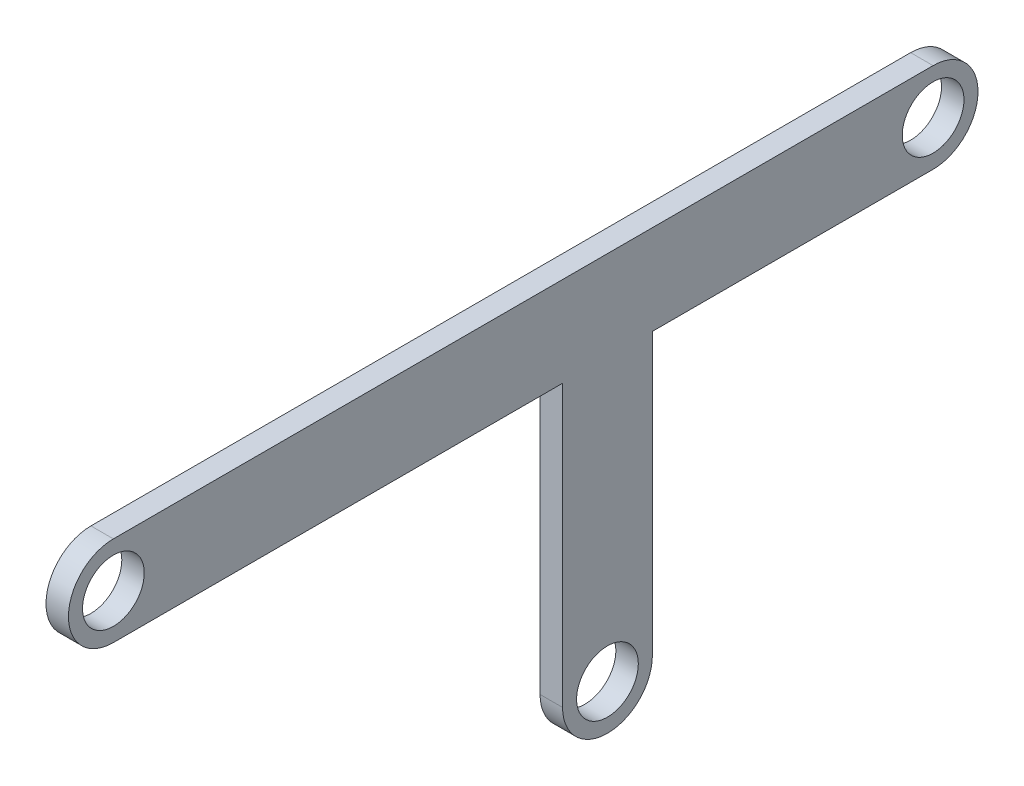
ISO-10303-21;
HEADER;
FILE_DESCRIPTION(('STEP AP214'),'2;1');
FILE_NAME('part.step','',(''),(''),'','','');
FILE_SCHEMA(('AUTOMOTIVE_DESIGN { 1 0 10303 214 1 1 1 1 }'));
ENDSEC;
DATA;
#1=APPLICATION_CONTEXT('core data for automotive mechanical design processes');
#2=APPLICATION_PROTOCOL_DEFINITION('international standard','automotive_design',2000,#1);
#3=PRODUCT_CONTEXT('',#1,'mechanical');
#4=PRODUCT('Part','Part','',(#3));
#5=PRODUCT_RELATED_PRODUCT_CATEGORY('part','',(#4));
#6=PRODUCT_DEFINITION_FORMATION('','',#4);
#7=PRODUCT_DEFINITION_CONTEXT('part definition',#1,'design');
#8=PRODUCT_DEFINITION('design','',#6,#7);
#9=PRODUCT_DEFINITION_SHAPE('','',#8);
#10=(LENGTH_UNIT() NAMED_UNIT(*) SI_UNIT(.MILLI.,.METRE.));
#11=(NAMED_UNIT(*) PLANE_ANGLE_UNIT() SI_UNIT($,.RADIAN.));
#12=(NAMED_UNIT(*) SI_UNIT($,.STERADIAN.) SOLID_ANGLE_UNIT());
#13=UNCERTAINTY_MEASURE_WITH_UNIT(LENGTH_MEASURE(1.E-05),#10,'distance_accuracy_value','');
#14=(GEOMETRIC_REPRESENTATION_CONTEXT(3) GLOBAL_UNCERTAINTY_ASSIGNED_CONTEXT((#13)) GLOBAL_UNIT_ASSIGNED_CONTEXT((#10,
#11,#12)) REPRESENTATION_CONTEXT('',''));
#15=CARTESIAN_POINT('',(0.,0.,0.));
#16=DIRECTION('',(0.,0.,1.));
#17=DIRECTION('',(1.,0.,0.));
#18=AXIS2_PLACEMENT_3D('',#15,#16,#17);
#19=CARTESIAN_POINT('',(-2.,0.,-44.));
#20=DIRECTION('',(0.,0.,1.));
#21=DIRECTION('',(1.,0.,0.));
#22=AXIS2_PLACEMENT_3D('',#19,#20,#21);
#23=PLANE('',#22);
#24=DIRECTION('',(0.,-1.,0.));
#25=VECTOR('',#24,1.);
#26=CARTESIAN_POINT('',(0.,0.,-44.));
#27=LINE('',#26,#25);
#28=CARTESIAN_POINT('',(0.,4.00000000000001,-44.));
#29=VERTEX_POINT('',#28);
#30=CARTESIAN_POINT('',(0.,-21.,-44.));
#31=VERTEX_POINT('',#30);
#32=EDGE_CURVE('E160',#29,#31,#27,.T.);
#33=ORIENTED_EDGE('',*,*,#32,.F.);
#34=DIRECTION('',(1.,0.,0.));
#35=VECTOR('',#34,1.);
#36=CARTESIAN_POINT('',(-2.,4.00000000000001,-44.));
#37=LINE('',#36,#35);
#38=CARTESIAN_POINT('',(-2.,4.00000000000001,-44.));
#39=VERTEX_POINT('',#38);
#40=EDGE_CURVE('E11',#39,#29,#37,.T.);
#41=ORIENTED_EDGE('',*,*,#40,.F.);
#42=DIRECTION('',(0.,-1.,0.));
#43=VECTOR('',#42,1.);
#44=CARTESIAN_POINT('',(-2.,0.,-44.));
#45=LINE('',#44,#43);
#46=CARTESIAN_POINT('',(-2.,-21.,-44.));
#47=VERTEX_POINT('',#46);
#48=EDGE_CURVE('E203',#39,#47,#45,.T.);
#49=ORIENTED_EDGE('',*,*,#48,.T.);
#50=DIRECTION('',(1.,0.,0.));
#51=VECTOR('',#50,1.);
#52=CARTESIAN_POINT('',(-2.,-21.,-44.));
#53=LINE('',#52,#51);
#54=EDGE_CURVE('E51',#47,#31,#53,.T.);
#55=ORIENTED_EDGE('',*,*,#54,.T.);
#56=EDGE_LOOP('',(#33,#41,#49,#55));
#57=FACE_BOUND('',#56,.T.);
#58=ADVANCED_FACE('F47',(#57),#23,.T.);
#59=CARTESIAN_POINT('',(-2.,4.00000000000001,0.));
#60=DIRECTION('',(0.,-1.,0.));
#61=DIRECTION('',(0.,0.,-1.));
#62=AXIS2_PLACEMENT_3D('',#59,#60,#61);
#63=PLANE('',#62);
#64=DIRECTION('',(0.,0.,-1.));
#65=VECTOR('',#64,1.);
#66=CARTESIAN_POINT('',(0.,4.00000000000001,0.));
#67=LINE('',#66,#65);
#68=CARTESIAN_POINT('',(0.,4.00000000000001,-4.));
#69=VERTEX_POINT('',#68);
#70=EDGE_CURVE('E185',#69,#29,#67,.T.);
#71=ORIENTED_EDGE('',*,*,#70,.F.);
#72=DIRECTION('',(1.,0.,0.));
#73=VECTOR('',#72,1.);
#74=CARTESIAN_POINT('',(-2.,4.00000000000001,-4.));
#75=LINE('',#74,#73);
#76=CARTESIAN_POINT('',(-2.,4.00000000000001,-4.));
#77=VERTEX_POINT('',#76);
#78=EDGE_CURVE('E58',#77,#69,#75,.T.);
#79=ORIENTED_EDGE('',*,*,#78,.F.);
#80=DIRECTION('',(0.,0.,-1.));
#81=VECTOR('',#80,1.);
#82=CARTESIAN_POINT('',(-2.,4.00000000000001,0.));
#83=LINE('',#82,#81);
#84=EDGE_CURVE('E141',#77,#39,#83,.T.);
#85=ORIENTED_EDGE('',*,*,#84,.T.);
#86=ORIENTED_EDGE('',*,*,#40,.T.);
#87=EDGE_LOOP('',(#71,#79,#85,#86));
#88=FACE_BOUND('',#87,.T.);
#89=ADVANCED_FACE('F208',(#88),#63,.T.);
#90=CARTESIAN_POINT('',(-2.,8.00000000000001,-4.));
#91=DIRECTION('',(1.,0.,0.));
#92=DIRECTION('',(0.,0.,-1.));
#93=AXIS2_PLACEMENT_3D('',#90,#91,#92);
#94=CYLINDRICAL_SURFACE('',#93,4.);
#95=CARTESIAN_POINT('',(0.,8.00000000000001,-4.));
#96=DIRECTION('',(1.,0.,0.));
#97=DIRECTION('',(0.,0.,-1.));
#98=AXIS2_PLACEMENT_3D('',#95,#96,#97);
#99=CIRCLE('',#98,4.);
#100=CARTESIAN_POINT('',(0.,12.,-4.));
#101=VERTEX_POINT('',#100);
#102=EDGE_CURVE('E124',#101,#69,#99,.T.);
#103=ORIENTED_EDGE('',*,*,#102,.F.);
#104=DIRECTION('',(1.,0.,0.));
#105=VECTOR('',#104,1.);
#106=CARTESIAN_POINT('',(-2.,12.,-4.));
#107=LINE('',#106,#105);
#108=CARTESIAN_POINT('',(-2.,12.,-4.));
#109=VERTEX_POINT('',#108);
#110=EDGE_CURVE('E118',#109,#101,#107,.T.);
#111=ORIENTED_EDGE('',*,*,#110,.F.);
#112=CARTESIAN_POINT('',(-2.,8.00000000000001,-4.));
#113=DIRECTION('',(1.,0.,0.));
#114=DIRECTION('',(0.,0.,-1.));
#115=AXIS2_PLACEMENT_3D('',#112,#113,#114);
#116=CIRCLE('',#115,4.);
#117=EDGE_CURVE('E122',#109,#77,#116,.T.);
#118=ORIENTED_EDGE('',*,*,#117,.T.);
#119=ORIENTED_EDGE('',*,*,#78,.T.);
#120=EDGE_LOOP('',(#103,#111,#118,#119));
#121=FACE_BOUND('',#120,.T.);
#122=ADVANCED_FACE('F120',(#121),#94,.T.);
#123=CARTESIAN_POINT('',(-2.,12.,0.));
#124=DIRECTION('',(0.,-1.,0.));
#125=DIRECTION('',(0.,0.,-1.));
#126=AXIS2_PLACEMENT_3D('',#123,#124,#125);
#127=PLANE('',#126);
#128=DIRECTION('',(0.,0.,-1.));
#129=VECTOR('',#128,1.);
#130=CARTESIAN_POINT('',(0.,12.,0.));
#131=LINE('',#130,#129);
#132=CARTESIAN_POINT('',(0.,12.,-77.));
#133=VERTEX_POINT('',#132);
#134=EDGE_CURVE('E180',#101,#133,#131,.T.);
#135=ORIENTED_EDGE('',*,*,#134,.T.);
#136=DIRECTION('',(1.,0.,0.));
#137=VECTOR('',#136,1.);
#138=CARTESIAN_POINT('',(-2.,12.,-77.));
#139=LINE('',#138,#137);
#140=CARTESIAN_POINT('',(-2.,12.,-77.));
#141=VERTEX_POINT('',#140);
#142=EDGE_CURVE('E129',#141,#133,#139,.T.);
#143=ORIENTED_EDGE('',*,*,#142,.F.);
#144=DIRECTION('',(0.,0.,-1.));
#145=VECTOR('',#144,1.);
#146=CARTESIAN_POINT('',(-2.,12.,0.));
#147=LINE('',#146,#145);
#148=EDGE_CURVE('E132',#109,#141,#147,.T.);
#149=ORIENTED_EDGE('',*,*,#148,.F.);
#150=ORIENTED_EDGE('',*,*,#110,.T.);
#151=EDGE_LOOP('',(#135,#143,#149,#150));
#152=FACE_BOUND('',#151,.T.);
#153=ADVANCED_FACE('F133',(#152),#127,.F.);
#154=CARTESIAN_POINT('',(-2.,8.00000000000001,-77.));
#155=DIRECTION('',(1.,0.,0.));
#156=DIRECTION('',(0.,0.,-1.));
#157=AXIS2_PLACEMENT_3D('',#154,#155,#156);
#158=CYLINDRICAL_SURFACE('',#157,4.);
#159=CARTESIAN_POINT('',(0.,8.00000000000001,-77.));
#160=DIRECTION('',(1.,0.,0.));
#161=DIRECTION('',(0.,0.,-1.));
#162=AXIS2_PLACEMENT_3D('',#159,#160,#161);
#163=CIRCLE('',#162,4.);
#164=CARTESIAN_POINT('',(0.,4.00000000000001,-77.));
#165=VERTEX_POINT('',#164);
#166=EDGE_CURVE('E176',#165,#133,#163,.T.);
#167=ORIENTED_EDGE('',*,*,#166,.F.);
#168=DIRECTION('',(1.,0.,0.));
#169=VECTOR('',#168,1.);
#170=CARTESIAN_POINT('',(-2.,4.00000000000001,-77.));
#171=LINE('',#170,#169);
#172=CARTESIAN_POINT('',(-2.,4.00000000000001,-77.));
#173=VERTEX_POINT('',#172);
#174=EDGE_CURVE('E194',#173,#165,#171,.T.);
#175=ORIENTED_EDGE('',*,*,#174,.F.);
#176=CARTESIAN_POINT('',(-2.,8.00000000000001,-77.));
#177=DIRECTION('',(1.,0.,0.));
#178=DIRECTION('',(0.,0.,-1.));
#179=AXIS2_PLACEMENT_3D('',#176,#177,#178);
#180=CIRCLE('',#179,4.);
#181=EDGE_CURVE('E138',#173,#141,#180,.T.);
#182=ORIENTED_EDGE('',*,*,#181,.T.);
#183=ORIENTED_EDGE('',*,*,#142,.T.);
#184=EDGE_LOOP('',(#167,#175,#182,#183));
#185=FACE_BOUND('',#184,.T.);
#186=ADVANCED_FACE('F222',(#185),#158,.T.);
#187=CARTESIAN_POINT('',(-2.,4.00000000000001,0.));
#188=DIRECTION('',(0.,-1.,0.));
#189=DIRECTION('',(0.,0.,-1.));
#190=AXIS2_PLACEMENT_3D('',#187,#188,#189);
#191=PLANE('',#190);
#192=DIRECTION('',(0.,0.,-1.));
#193=VECTOR('',#192,1.);
#194=CARTESIAN_POINT('',(0.,4.00000000000001,0.));
#195=LINE('',#194,#193);
#196=CARTESIAN_POINT('',(0.,4.00000000000001,-52.));
#197=VERTEX_POINT('',#196);
#198=EDGE_CURVE('E172',#197,#165,#195,.T.);
#199=ORIENTED_EDGE('',*,*,#198,.F.);
#200=DIRECTION('',(1.,0.,0.));
#201=VECTOR('',#200,1.);
#202=CARTESIAN_POINT('',(-2.,4.00000000000001,-52.));
#203=LINE('',#202,#201);
#204=CARTESIAN_POINT('',(-2.,4.00000000000001,-52.));
#205=VERTEX_POINT('',#204);
#206=EDGE_CURVE('E197',#205,#197,#203,.T.);
#207=ORIENTED_EDGE('',*,*,#206,.F.);
#208=DIRECTION('',(0.,0.,-1.));
#209=VECTOR('',#208,1.);
#210=CARTESIAN_POINT('',(-2.,4.00000000000001,0.));
#211=LINE('',#210,#209);
#212=EDGE_CURVE('E286',#205,#173,#211,.T.);
#213=ORIENTED_EDGE('',*,*,#212,.T.);
#214=ORIENTED_EDGE('',*,*,#174,.T.);
#215=EDGE_LOOP('',(#199,#207,#213,#214));
#216=FACE_BOUND('',#215,.T.);
#217=ADVANCED_FACE('F225',(#216),#191,.T.);
#218=CARTESIAN_POINT('',(-2.,0.,-52.));
#219=DIRECTION('',(0.,0.,1.));
#220=DIRECTION('',(1.,0.,0.));
#221=AXIS2_PLACEMENT_3D('',#218,#219,#220);
#222=PLANE('',#221);
#223=DIRECTION('',(0.,-1.,0.));
#224=VECTOR('',#223,1.);
#225=CARTESIAN_POINT('',(0.,0.,-52.));
#226=LINE('',#225,#224);
#227=CARTESIAN_POINT('',(0.,-21.,-52.));
#228=VERTEX_POINT('',#227);
#229=EDGE_CURVE('E168',#197,#228,#226,.T.);
#230=ORIENTED_EDGE('',*,*,#229,.T.);
#231=DIRECTION('',(1.,0.,0.));
#232=VECTOR('',#231,1.);
#233=CARTESIAN_POINT('',(-2.,-21.,-52.));
#234=LINE('',#233,#232);
#235=CARTESIAN_POINT('',(-2.,-21.,-52.));
#236=VERTEX_POINT('',#235);
#237=EDGE_CURVE('E199',#236,#228,#234,.T.);
#238=ORIENTED_EDGE('',*,*,#237,.F.);
#239=DIRECTION('',(0.,-1.,0.));
#240=VECTOR('',#239,1.);
#241=CARTESIAN_POINT('',(-2.,0.,-52.));
#242=LINE('',#241,#240);
#243=EDGE_CURVE('E283',#205,#236,#242,.T.);
#244=ORIENTED_EDGE('',*,*,#243,.F.);
#245=ORIENTED_EDGE('',*,*,#206,.T.);
#246=EDGE_LOOP('',(#230,#238,#244,#245));
#247=FACE_BOUND('',#246,.T.);
#248=ADVANCED_FACE('F229',(#247),#222,.F.);
#249=CARTESIAN_POINT('',(-2.,-21.,-48.));
#250=DIRECTION('',(1.,0.,0.));
#251=DIRECTION('',(0.,0.,-1.));
#252=AXIS2_PLACEMENT_3D('',#249,#250,#251);
#253=CYLINDRICAL_SURFACE('',#252,2.75);
#254=CARTESIAN_POINT('',(-2.,-21.,-48.));
#255=DIRECTION('',(1.,0.,0.));
#256=DIRECTION('',(0.,0.,-1.));
#257=AXIS2_PLACEMENT_3D('',#254,#255,#256);
#258=CIRCLE('',#257,2.75);
#259=CARTESIAN_POINT('',(-2.,-21.,-50.75));
#260=VERTEX_POINT('',#259);
#261=EDGE_CURVE('E271',#260,#260,#258,.T.);
#262=ORIENTED_EDGE('',*,*,#261,.F.);
#263=EDGE_LOOP('',(#262));
#264=FACE_BOUND('',#263,.T.);
#265=CARTESIAN_POINT('',(0.,-21.,-48.));
#266=DIRECTION('',(1.,0.,0.));
#267=DIRECTION('',(0.,0.,-1.));
#268=AXIS2_PLACEMENT_3D('',#265,#266,#267);
#269=CIRCLE('',#268,2.75);
#270=CARTESIAN_POINT('',(0.,-21.,-50.75));
#271=VERTEX_POINT('',#270);
#272=EDGE_CURVE('E156',#271,#271,#269,.T.);
#273=ORIENTED_EDGE('',*,*,#272,.T.);
#274=EDGE_LOOP('',(#273));
#275=FACE_BOUND('',#274,.T.);
#276=ADVANCED_FACE('F233',(#264,#275),#253,.F.);
#277=CARTESIAN_POINT('',(-2.,8.00000000000001,-77.));
#278=DIRECTION('',(1.,0.,0.));
#279=DIRECTION('',(0.,0.,-1.));
#280=AXIS2_PLACEMENT_3D('',#277,#278,#279);
#281=CYLINDRICAL_SURFACE('',#280,2.75000000000001);
#282=CARTESIAN_POINT('',(-2.,8.00000000000001,-77.));
#283=DIRECTION('',(1.,0.,0.));
#284=DIRECTION('',(0.,0.,-1.));
#285=AXIS2_PLACEMENT_3D('',#282,#283,#284);
#286=CIRCLE('',#285,2.75000000000001);
#287=CARTESIAN_POINT('',(-2.,8.00000000000001,-79.75));
#288=VERTEX_POINT('',#287);
#289=EDGE_CURVE('E249',#288,#288,#286,.T.);
#290=ORIENTED_EDGE('',*,*,#289,.F.);
#291=EDGE_LOOP('',(#290));
#292=FACE_BOUND('',#291,.T.);
#293=CARTESIAN_POINT('',(0.,8.00000000000001,-77.));
#294=DIRECTION('',(1.,0.,0.));
#295=DIRECTION('',(0.,0.,-1.));
#296=AXIS2_PLACEMENT_3D('',#293,#294,#295);
#297=CIRCLE('',#296,2.75000000000001);
#298=CARTESIAN_POINT('',(0.,8.00000000000001,-79.75));
#299=VERTEX_POINT('',#298);
#300=EDGE_CURVE('E152',#299,#299,#297,.T.);
#301=ORIENTED_EDGE('',*,*,#300,.T.);
#302=EDGE_LOOP('',(#301));
#303=FACE_BOUND('',#302,.T.);
#304=ADVANCED_FACE('F238',(#292,#303),#281,.F.);
#305=CARTESIAN_POINT('',(-2.,8.00000000000001,-4.));
#306=DIRECTION('',(1.,0.,0.));
#307=DIRECTION('',(0.,0.,-1.));
#308=AXIS2_PLACEMENT_3D('',#305,#306,#307);
#309=CYLINDRICAL_SURFACE('',#308,2.75);
#310=CARTESIAN_POINT('',(-2.,8.00000000000001,-4.));
#311=DIRECTION('',(1.,0.,0.));
#312=DIRECTION('',(0.,0.,-1.));
#313=AXIS2_PLACEMENT_3D('',#310,#311,#312);
#314=CIRCLE('',#313,2.75);
#315=CARTESIAN_POINT('',(-2.,8.00000000000001,-6.75));
#316=VERTEX_POINT('',#315);
#317=EDGE_CURVE('E188',#316,#316,#314,.T.);
#318=ORIENTED_EDGE('',*,*,#317,.F.);
#319=EDGE_LOOP('',(#318));
#320=FACE_BOUND('',#319,.T.);
#321=CARTESIAN_POINT('',(0.,8.00000000000001,-4.));
#322=DIRECTION('',(1.,0.,0.));
#323=DIRECTION('',(0.,0.,-1.));
#324=AXIS2_PLACEMENT_3D('',#321,#322,#323);
#325=CIRCLE('',#324,2.75);
#326=CARTESIAN_POINT('',(0.,8.00000000000001,-6.75));
#327=VERTEX_POINT('',#326);
#328=EDGE_CURVE('E148',#327,#327,#325,.T.);
#329=ORIENTED_EDGE('',*,*,#328,.T.);
#330=EDGE_LOOP('',(#329));
#331=FACE_BOUND('',#330,.T.);
#332=ADVANCED_FACE('F49',(#320,#331),#309,.F.);
#333=CARTESIAN_POINT('',(-2.,-21.,-48.));
#334=DIRECTION('',(1.,0.,0.));
#335=DIRECTION('',(0.,0.,-1.));
#336=AXIS2_PLACEMENT_3D('',#333,#334,#335);
#337=CYLINDRICAL_SURFACE('',#336,4.);
#338=CARTESIAN_POINT('',(0.,-21.,-48.));
#339=DIRECTION('',(1.,0.,0.));
#340=DIRECTION('',(0.,0.,-1.));
#341=AXIS2_PLACEMENT_3D('',#338,#339,#340);
#342=CIRCLE('',#341,4.);
#343=EDGE_CURVE('E164',#31,#228,#342,.T.);
#344=ORIENTED_EDGE('',*,*,#343,.F.);
#345=ORIENTED_EDGE('',*,*,#54,.F.);
#346=CARTESIAN_POINT('',(-2.,-21.,-48.));
#347=DIRECTION('',(1.,0.,0.));
#348=DIRECTION('',(0.,0.,-1.));
#349=AXIS2_PLACEMENT_3D('',#346,#347,#348);
#350=CIRCLE('',#349,4.);
#351=EDGE_CURVE('E276',#47,#236,#350,.T.);
#352=ORIENTED_EDGE('',*,*,#351,.T.);
#353=ORIENTED_EDGE('',*,*,#237,.T.);
#354=EDGE_LOOP('',(#344,#345,#352,#353));
#355=FACE_BOUND('',#354,.T.);
#356=ADVANCED_FACE('F204',(#355),#337,.T.);
#357=CARTESIAN_POINT('',(-2.,0.,0.));
#358=DIRECTION('',(1.,0.,0.));
#359=DIRECTION('',(0.,0.,-1.));
#360=AXIS2_PLACEMENT_3D('',#357,#358,#359);
#361=PLANE('',#360);
#362=ORIENTED_EDGE('',*,*,#317,.T.);
#363=EDGE_LOOP('',(#362));
#364=FACE_BOUND('',#363,.T.);
#365=ORIENTED_EDGE('',*,*,#289,.T.);
#366=EDGE_LOOP('',(#365));
#367=FACE_BOUND('',#366,.T.);
#368=ORIENTED_EDGE('',*,*,#261,.T.);
#369=EDGE_LOOP('',(#368));
#370=FACE_BOUND('',#369,.T.);
#371=ORIENTED_EDGE('',*,*,#48,.F.);
#372=ORIENTED_EDGE('',*,*,#84,.F.);
#373=ORIENTED_EDGE('',*,*,#117,.F.);
#374=ORIENTED_EDGE('',*,*,#148,.T.);
#375=ORIENTED_EDGE('',*,*,#181,.F.);
#376=ORIENTED_EDGE('',*,*,#212,.F.);
#377=ORIENTED_EDGE('',*,*,#243,.T.);
#378=ORIENTED_EDGE('',*,*,#351,.F.);
#379=EDGE_LOOP('',(#371,#372,#373,#374,#375,#376,#377,#378));
#380=FACE_BOUND('',#379,.T.);
#381=ADVANCED_FACE('F140',(#364,#367,#370,#380),#361,.F.);
#382=CARTESIAN_POINT('',(0.,0.,0.));
#383=DIRECTION('',(1.,0.,0.));
#384=DIRECTION('',(0.,0.,-1.));
#385=AXIS2_PLACEMENT_3D('',#382,#383,#384);
#386=PLANE('',#385);
#387=ORIENTED_EDGE('',*,*,#328,.F.);
#388=EDGE_LOOP('',(#387));
#389=FACE_BOUND('',#388,.T.);
#390=ORIENTED_EDGE('',*,*,#300,.F.);
#391=EDGE_LOOP('',(#390));
#392=FACE_BOUND('',#391,.T.);
#393=ORIENTED_EDGE('',*,*,#272,.F.);
#394=EDGE_LOOP('',(#393));
#395=FACE_BOUND('',#394,.T.);
#396=ORIENTED_EDGE('',*,*,#32,.T.);
#397=ORIENTED_EDGE('',*,*,#343,.T.);
#398=ORIENTED_EDGE('',*,*,#229,.F.);
#399=ORIENTED_EDGE('',*,*,#198,.T.);
#400=ORIENTED_EDGE('',*,*,#166,.T.);
#401=ORIENTED_EDGE('',*,*,#134,.F.);
#402=ORIENTED_EDGE('',*,*,#102,.T.);
#403=ORIENTED_EDGE('',*,*,#70,.T.);
#404=EDGE_LOOP('',(#396,#397,#398,#399,#400,#401,#402,#403));
#405=FACE_BOUND('',#404,.T.);
#406=ADVANCED_FACE('F207',(#389,#392,#395,#405),#386,.T.);
#407=CLOSED_SHELL('',(#58,#89,#122,#153,#186,#217,#248,#276,#304,#332,#356,#381,#406));
#408=MANIFOLD_SOLID_BREP('B2',#407);
#409=ADVANCED_BREP_SHAPE_REPRESENTATION('',(#18,#408),#14);
#410=SHAPE_DEFINITION_REPRESENTATION(#9,#409);
ENDSEC;
END-ISO-10303-21;
